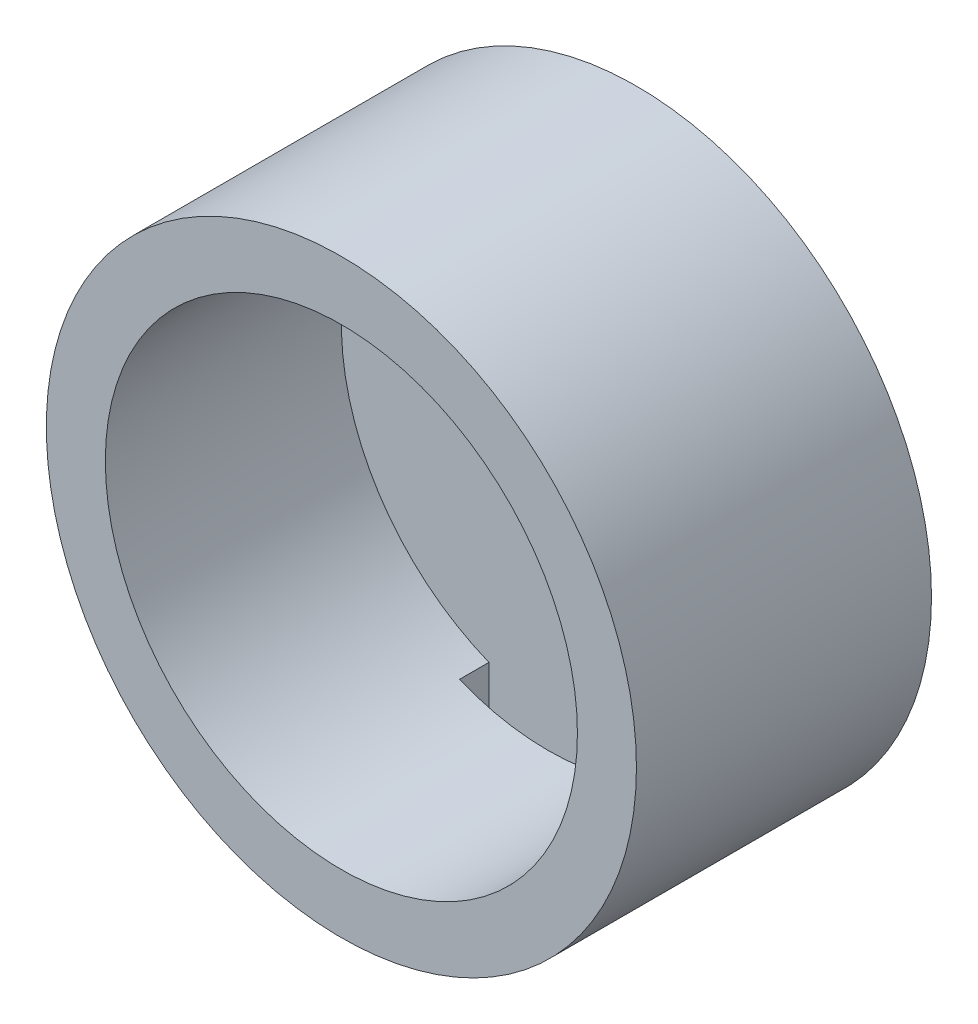
ISO-10303-21;
HEADER;
FILE_DESCRIPTION(('STEP AP214'),'2;1');
FILE_NAME('part.step','',(''),(''),'','','');
FILE_SCHEMA(('AUTOMOTIVE_DESIGN { 1 0 10303 214 1 1 1 1 }'));
ENDSEC;
DATA;
#1=APPLICATION_CONTEXT('core data for automotive mechanical design processes');
#2=APPLICATION_PROTOCOL_DEFINITION('international standard','automotive_design',2000,#1);
#3=PRODUCT_CONTEXT('',#1,'mechanical');
#4=PRODUCT('Part','Part','',(#3));
#5=PRODUCT_RELATED_PRODUCT_CATEGORY('part','',(#4));
#6=PRODUCT_DEFINITION_FORMATION('','',#4);
#7=PRODUCT_DEFINITION_CONTEXT('part definition',#1,'design');
#8=PRODUCT_DEFINITION('design','',#6,#7);
#9=PRODUCT_DEFINITION_SHAPE('','',#8);
#10=(LENGTH_UNIT() NAMED_UNIT(*) SI_UNIT(.MILLI.,.METRE.));
#11=(NAMED_UNIT(*) PLANE_ANGLE_UNIT() SI_UNIT($,.RADIAN.));
#12=(NAMED_UNIT(*) SI_UNIT($,.STERADIAN.) SOLID_ANGLE_UNIT());
#13=UNCERTAINTY_MEASURE_WITH_UNIT(LENGTH_MEASURE(1.E-05),#10,'distance_accuracy_value','');
#14=(GEOMETRIC_REPRESENTATION_CONTEXT(3) GLOBAL_UNCERTAINTY_ASSIGNED_CONTEXT((#13)) GLOBAL_UNIT_ASSIGNED_CONTEXT((#10,
#11,#12)) REPRESENTATION_CONTEXT('',''));
#15=CARTESIAN_POINT('',(0.,0.,0.));
#16=DIRECTION('',(0.,0.,1.));
#17=DIRECTION('',(1.,0.,0.));
#18=AXIS2_PLACEMENT_3D('',#15,#16,#17);
#19=CARTESIAN_POINT('',(0.,0.,50.));
#20=DIRECTION('',(0.,0.,-1.));
#21=DIRECTION('',(-1.,0.,0.));
#22=AXIS2_PLACEMENT_3D('',#19,#20,#21);
#23=CYLINDRICAL_SURFACE('',#22,50.);
#24=CARTESIAN_POINT('',(0.,0.,10.));
#25=DIRECTION('',(0.,0.,-1.));
#26=DIRECTION('',(-1.,0.,0.));
#27=AXIS2_PLACEMENT_3D('',#24,#25,#26);
#28=CIRCLE('',#27,50.);
#29=CARTESIAN_POINT('',(15.,-47.6969600708473,10.));
#30=VERTEX_POINT('',#29);
#31=CARTESIAN_POINT('',(-15.,-47.6969600708473,10.));
#32=VERTEX_POINT('',#31);
#33=EDGE_CURVE('E107',#30,#32,#28,.T.);
#34=ORIENTED_EDGE('',*,*,#33,.T.);
#35=DIRECTION('',(0.,0.,-1.));
#36=VECTOR('',#35,1.);
#37=CARTESIAN_POINT('',(-15.,-47.6969600708473,50.));
#38=LINE('',#37,#36);
#39=CARTESIAN_POINT('',(-15.,-47.6969600708473,15.));
#40=VERTEX_POINT('',#39);
#41=EDGE_CURVE('E102',#32,#40,#38,.F.);
#42=ORIENTED_EDGE('',*,*,#41,.T.);
#43=CARTESIAN_POINT('',(0.,0.,15.));
#44=DIRECTION('',(0.,0.,1.));
#45=DIRECTION('',(1.,0.,0.));
#46=AXIS2_PLACEMENT_3D('',#43,#44,#45);
#47=CIRCLE('',#46,50.);
#48=CARTESIAN_POINT('',(15.,-47.6969600708473,15.));
#49=VERTEX_POINT('',#48);
#50=EDGE_CURVE('E105',#40,#49,#47,.T.);
#51=ORIENTED_EDGE('',*,*,#50,.T.);
#52=DIRECTION('',(0.,0.,-1.));
#53=VECTOR('',#52,1.);
#54=CARTESIAN_POINT('',(15.,-47.6969600708473,50.));
#55=LINE('',#54,#53);
#56=EDGE_CURVE('E85',#49,#30,#55,.T.);
#57=ORIENTED_EDGE('',*,*,#56,.T.);
#58=EDGE_LOOP('',(#34,#42,#51,#57));
#59=FACE_BOUND('',#58,.T.);
#60=CARTESIAN_POINT('',(0.,0.,50.));
#61=DIRECTION('',(0.,0.,1.));
#62=DIRECTION('',(1.,0.,0.));
#63=AXIS2_PLACEMENT_3D('',#60,#61,#62);
#64=CIRCLE('',#63,50.);
#65=CARTESIAN_POINT('',(50.,0.,50.));
#66=VERTEX_POINT('',#65);
#67=EDGE_CURVE('E46',#66,#66,#64,.T.);
#68=ORIENTED_EDGE('',*,*,#67,.F.);
#69=EDGE_LOOP('',(#68));
#70=FACE_BOUND('',#69,.T.);
#71=CARTESIAN_POINT('',(0.,0.,0.));
#72=DIRECTION('',(0.,0.,1.));
#73=DIRECTION('',(1.,0.,0.));
#74=AXIS2_PLACEMENT_3D('',#71,#72,#73);
#75=CIRCLE('',#74,50.);
#76=CARTESIAN_POINT('',(50.,0.,0.));
#77=VERTEX_POINT('',#76);
#78=EDGE_CURVE('E112',#77,#77,#75,.T.);
#79=ORIENTED_EDGE('',*,*,#78,.T.);
#80=EDGE_LOOP('',(#79));
#81=FACE_BOUND('',#80,.T.);
#82=ADVANCED_FACE('F39',(#59,#70,#81),#23,.T.);
#83=CARTESIAN_POINT('',(0.,0.,50.));
#84=DIRECTION('',(0.,0.,1.));
#85=DIRECTION('',(1.,0.,0.));
#86=AXIS2_PLACEMENT_3D('',#83,#84,#85);
#87=PLANE('',#86);
#88=CARTESIAN_POINT('',(0.,0.,50.));
#89=DIRECTION('',(0.,0.,1.));
#90=DIRECTION('',(1.,0.,0.));
#91=AXIS2_PLACEMENT_3D('',#88,#89,#90);
#92=CIRCLE('',#91,40.);
#93=CARTESIAN_POINT('',(40.,0.,50.));
#94=VERTEX_POINT('',#93);
#95=EDGE_CURVE('E110',#94,#94,#92,.T.);
#96=ORIENTED_EDGE('',*,*,#95,.F.);
#97=EDGE_LOOP('',(#96));
#98=FACE_BOUND('',#97,.T.);
#99=ORIENTED_EDGE('',*,*,#67,.T.);
#100=EDGE_LOOP('',(#99));
#101=FACE_BOUND('',#100,.T.);
#102=ADVANCED_FACE('F122',(#98,#101),#87,.T.);
#103=CARTESIAN_POINT('',(0.,0.,0.));
#104=DIRECTION('',(0.,0.,1.));
#105=DIRECTION('',(1.,0.,0.));
#106=AXIS2_PLACEMENT_3D('',#103,#104,#105);
#107=PLANE('',#106);
#108=ORIENTED_EDGE('',*,*,#78,.F.);
#109=EDGE_LOOP('',(#108));
#110=FACE_BOUND('',#109,.T.);
#111=ADVANCED_FACE('F120',(#110),#107,.F.);
#112=CARTESIAN_POINT('',(0.,0.,10.));
#113=DIRECTION('',(0.,0.,1.));
#114=DIRECTION('',(1.,0.,0.));
#115=AXIS2_PLACEMENT_3D('',#112,#113,#114);
#116=CYLINDRICAL_SURFACE('',#115,40.);
#117=CARTESIAN_POINT('',(0.,0.,15.));
#118=DIRECTION('',(0.,0.,1.));
#119=DIRECTION('',(1.,0.,0.));
#120=AXIS2_PLACEMENT_3D('',#117,#118,#119);
#121=CIRCLE('',#120,40.);
#122=CARTESIAN_POINT('',(15.,-37.0809924354783,15.));
#123=VERTEX_POINT('',#122);
#124=CARTESIAN_POINT('',(-15.,-37.0809924354783,15.));
#125=VERTEX_POINT('',#124);
#126=EDGE_CURVE('E11',#123,#125,#121,.F.);
#127=ORIENTED_EDGE('',*,*,#126,.T.);
#128=DIRECTION('',(0.,0.,1.));
#129=VECTOR('',#128,1.);
#130=CARTESIAN_POINT('',(-15.,-37.0809924354783,10.));
#131=LINE('',#130,#129);
#132=CARTESIAN_POINT('',(-15.,-37.0809924354783,10.));
#133=VERTEX_POINT('',#132);
#134=EDGE_CURVE('E96',#125,#133,#131,.F.);
#135=ORIENTED_EDGE('',*,*,#134,.T.);
#136=CARTESIAN_POINT('',(0.,0.,10.));
#137=DIRECTION('',(0.,0.,1.));
#138=DIRECTION('',(1.,0.,0.));
#139=AXIS2_PLACEMENT_3D('',#136,#137,#138);
#140=CIRCLE('',#139,40.);
#141=CARTESIAN_POINT('',(15.,-37.0809924354783,10.));
#142=VERTEX_POINT('',#141);
#143=EDGE_CURVE('E93',#142,#133,#140,.T.);
#144=ORIENTED_EDGE('',*,*,#143,.F.);
#145=DIRECTION('',(0.,0.,1.));
#146=VECTOR('',#145,1.);
#147=CARTESIAN_POINT('',(15.,-37.0809924354783,10.));
#148=LINE('',#147,#146);
#149=EDGE_CURVE('E82',#142,#123,#148,.T.);
#150=ORIENTED_EDGE('',*,*,#149,.T.);
#151=EDGE_LOOP('',(#127,#135,#144,#150));
#152=FACE_BOUND('',#151,.T.);
#153=ORIENTED_EDGE('',*,*,#95,.T.);
#154=EDGE_LOOP('',(#153));
#155=FACE_BOUND('',#154,.T.);
#156=ADVANCED_FACE('F90',(#152,#155),#116,.F.);
#157=CARTESIAN_POINT('',(0.,0.,10.));
#158=DIRECTION('',(0.,0.,1.));
#159=DIRECTION('',(1.,0.,0.));
#160=AXIS2_PLACEMENT_3D('',#157,#158,#159);
#161=PLANE('',#160);
#162=ORIENTED_EDGE('',*,*,#143,.T.);
#163=DIRECTION('',(0.,1.,0.));
#164=VECTOR('',#163,1.);
#165=CARTESIAN_POINT('',(-15.,-193.,10.));
#166=LINE('',#165,#164);
#167=EDGE_CURVE('E94',#32,#133,#166,.T.);
#168=ORIENTED_EDGE('',*,*,#167,.F.);
#169=ORIENTED_EDGE('',*,*,#33,.F.);
#170=DIRECTION('',(0.,1.,0.));
#171=VECTOR('',#170,1.);
#172=CARTESIAN_POINT('',(15.,-193.,10.));
#173=LINE('',#172,#171);
#174=EDGE_CURVE('E87',#30,#142,#173,.T.);
#175=ORIENTED_EDGE('',*,*,#174,.T.);
#176=EDGE_LOOP('',(#162,#168,#169,#175));
#177=FACE_BOUND('',#176,.T.);
#178=ADVANCED_FACE('F127',(#177),#161,.T.);
#179=CARTESIAN_POINT('',(-15.,-193.,15.));
#180=DIRECTION('',(0.,0.,1.));
#181=DIRECTION('',(1.,0.,0.));
#182=AXIS2_PLACEMENT_3D('',#179,#180,#181);
#183=PLANE('',#182);
#184=DIRECTION('',(0.,1.,0.));
#185=VECTOR('',#184,1.);
#186=CARTESIAN_POINT('',(-15.,-193.,15.));
#187=LINE('',#186,#185);
#188=EDGE_CURVE('E58',#40,#125,#187,.T.);
#189=ORIENTED_EDGE('',*,*,#188,.T.);
#190=ORIENTED_EDGE('',*,*,#126,.F.);
#191=DIRECTION('',(0.,1.,0.));
#192=VECTOR('',#191,1.);
#193=CARTESIAN_POINT('',(15.,-193.,15.));
#194=LINE('',#193,#192);
#195=EDGE_CURVE('E53',#49,#123,#194,.T.);
#196=ORIENTED_EDGE('',*,*,#195,.F.);
#197=ORIENTED_EDGE('',*,*,#50,.F.);
#198=EDGE_LOOP('',(#189,#190,#196,#197));
#199=FACE_BOUND('',#198,.T.);
#200=ADVANCED_FACE('F75',(#199),#183,.F.);
#201=CARTESIAN_POINT('',(-15.,-193.,15.));
#202=DIRECTION('',(-1.,0.,0.));
#203=DIRECTION('',(0.,0.,1.));
#204=AXIS2_PLACEMENT_3D('',#201,#202,#203);
#205=PLANE('',#204);
#206=ORIENTED_EDGE('',*,*,#167,.T.);
#207=ORIENTED_EDGE('',*,*,#134,.F.);
#208=ORIENTED_EDGE('',*,*,#188,.F.);
#209=ORIENTED_EDGE('',*,*,#41,.F.);
#210=EDGE_LOOP('',(#206,#207,#208,#209));
#211=FACE_BOUND('',#210,.T.);
#212=ADVANCED_FACE('F142',(#211),#205,.F.);
#213=CARTESIAN_POINT('',(15.,-193.,15.));
#214=DIRECTION('',(1.,0.,0.));
#215=DIRECTION('',(0.,0.,-1.));
#216=AXIS2_PLACEMENT_3D('',#213,#214,#215);
#217=PLANE('',#216);
#218=ORIENTED_EDGE('',*,*,#195,.T.);
#219=ORIENTED_EDGE('',*,*,#149,.F.);
#220=ORIENTED_EDGE('',*,*,#174,.F.);
#221=ORIENTED_EDGE('',*,*,#56,.F.);
#222=EDGE_LOOP('',(#218,#219,#220,#221));
#223=FACE_BOUND('',#222,.T.);
#224=ADVANCED_FACE('F80',(#223),#217,.F.);
#225=CLOSED_SHELL('',(#82,#102,#111,#156,#178,#200,#212,#224));
#226=MANIFOLD_SOLID_BREP('B2',#225);
#227=ADVANCED_BREP_SHAPE_REPRESENTATION('',(#18,#226),#14);
#228=SHAPE_DEFINITION_REPRESENTATION(#9,#227);
ENDSEC;
END-ISO-10303-21;
